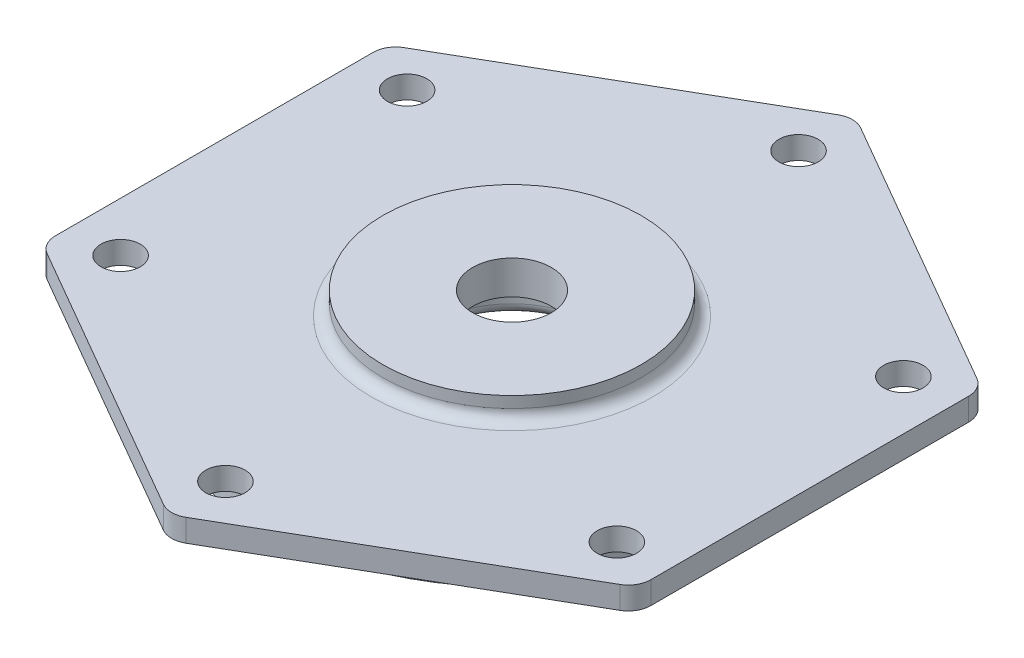
ISO-10303-21;
HEADER;
FILE_DESCRIPTION(('STEP AP214'),'2;1');
FILE_NAME('part.step','',(''),(''),'','','');
FILE_SCHEMA(('AUTOMOTIVE_DESIGN { 1 0 10303 214 1 1 1 1 }'));
ENDSEC;
DATA;
#1=APPLICATION_CONTEXT('core data for automotive mechanical design processes');
#2=APPLICATION_PROTOCOL_DEFINITION('international standard','automotive_design',2000,#1);
#3=PRODUCT_CONTEXT('',#1,'mechanical');
#4=PRODUCT('Part','Part','',(#3));
#5=PRODUCT_RELATED_PRODUCT_CATEGORY('part','',(#4));
#6=PRODUCT_DEFINITION_FORMATION('','',#4);
#7=PRODUCT_DEFINITION_CONTEXT('part definition',#1,'design');
#8=PRODUCT_DEFINITION('design','',#6,#7);
#9=PRODUCT_DEFINITION_SHAPE('','',#8);
#10=(LENGTH_UNIT() NAMED_UNIT(*) SI_UNIT(.MILLI.,.METRE.));
#11=(NAMED_UNIT(*) PLANE_ANGLE_UNIT() SI_UNIT($,.RADIAN.));
#12=(NAMED_UNIT(*) SI_UNIT($,.STERADIAN.) SOLID_ANGLE_UNIT());
#13=UNCERTAINTY_MEASURE_WITH_UNIT(LENGTH_MEASURE(1.E-05),#10,'distance_accuracy_value','');
#14=(GEOMETRIC_REPRESENTATION_CONTEXT(3) GLOBAL_UNCERTAINTY_ASSIGNED_CONTEXT((#13)) GLOBAL_UNIT_ASSIGNED_CONTEXT((#10,
#11,#12)) REPRESENTATION_CONTEXT('',''));
#15=CARTESIAN_POINT('',(0.,0.,0.));
#16=DIRECTION('',(0.,0.,1.));
#17=DIRECTION('',(1.,0.,0.));
#18=AXIS2_PLACEMENT_3D('',#15,#16,#17);
#19=CARTESIAN_POINT('',(-49.,4.,-28.2901631902917));
#20=DIRECTION('',(0.,-1.,0.));
#21=DIRECTION('',(0.,0.,-1.));
#22=AXIS2_PLACEMENT_3D('',#19,#20,#21);
#23=CYLINDRICAL_SURFACE('',#22,4.);
#24=CARTESIAN_POINT('',(-49.,0.,-28.2901631902917));
#25=DIRECTION('',(0.,1.,0.));
#26=DIRECTION('',(0.,0.,1.));
#27=AXIS2_PLACEMENT_3D('',#24,#25,#26);
#28=CIRCLE('',#27,4.);
#29=CARTESIAN_POINT('',(-51.,0.,-31.7542648054295));
#30=VERTEX_POINT('',#29);
#31=CARTESIAN_POINT('',(-53.,0.,-28.2901631902917));
#32=VERTEX_POINT('',#31);
#33=EDGE_CURVE('E172',#30,#32,#28,.T.);
#34=ORIENTED_EDGE('',*,*,#33,.T.);
#35=DIRECTION('',(0.,-1.,0.));
#36=VECTOR('',#35,1.);
#37=CARTESIAN_POINT('',(-53.,4.,-28.2901631902917));
#38=LINE('',#37,#36);
#39=CARTESIAN_POINT('',(-53.,4.,-28.2901631902917));
#40=VERTEX_POINT('',#39);
#41=EDGE_CURVE('E242',#40,#32,#38,.T.);
#42=ORIENTED_EDGE('',*,*,#41,.F.);
#43=CARTESIAN_POINT('',(-49.,4.,-28.2901631902917));
#44=DIRECTION('',(0.,1.,0.));
#45=DIRECTION('',(0.,0.,1.));
#46=AXIS2_PLACEMENT_3D('',#43,#44,#45);
#47=CIRCLE('',#46,4.);
#48=CARTESIAN_POINT('',(-51.,4.,-31.7542648054295));
#49=VERTEX_POINT('',#48);
#50=EDGE_CURVE('E207',#49,#40,#47,.T.);
#51=ORIENTED_EDGE('',*,*,#50,.F.);
#52=DIRECTION('',(0.,-1.,0.));
#53=VECTOR('',#52,1.);
#54=CARTESIAN_POINT('',(-51.,4.,-31.7542648054295));
#55=LINE('',#54,#53);
#56=EDGE_CURVE('E168',#49,#30,#55,.T.);
#57=ORIENTED_EDGE('',*,*,#56,.T.);
#58=EDGE_LOOP('',(#34,#42,#51,#57));
#59=FACE_BOUND('',#58,.T.);
#60=ADVANCED_FACE('F43',(#59),#23,.T.);
#61=CARTESIAN_POINT('',(-53.,4.,-28.2901631902917));
#62=DIRECTION('',(1.,0.,0.));
#63=DIRECTION('',(0.,0.,-1.));
#64=AXIS2_PLACEMENT_3D('',#61,#62,#63);
#65=PLANE('',#64);
#66=DIRECTION('',(0.,0.,1.));
#67=VECTOR('',#66,1.);
#68=CARTESIAN_POINT('',(-53.,0.,-28.2901631902917));
#69=LINE('',#68,#67);
#70=CARTESIAN_POINT('',(-53.,0.,28.2901631902916));
#71=VERTEX_POINT('',#70);
#72=EDGE_CURVE('E176',#32,#71,#69,.T.);
#73=ORIENTED_EDGE('',*,*,#72,.T.);
#74=DIRECTION('',(0.,-1.,0.));
#75=VECTOR('',#74,1.);
#76=CARTESIAN_POINT('',(-53.,4.,28.2901631902916));
#77=LINE('',#76,#75);
#78=CARTESIAN_POINT('',(-53.,4.,28.2901631902916));
#79=VERTEX_POINT('',#78);
#80=EDGE_CURVE('E238',#79,#71,#77,.T.);
#81=ORIENTED_EDGE('',*,*,#80,.F.);
#82=DIRECTION('',(0.,0.,1.));
#83=VECTOR('',#82,1.);
#84=CARTESIAN_POINT('',(-53.,4.,-28.2901631902917));
#85=LINE('',#84,#83);
#86=EDGE_CURVE('E119',#40,#79,#85,.T.);
#87=ORIENTED_EDGE('',*,*,#86,.F.);
#88=ORIENTED_EDGE('',*,*,#41,.T.);
#89=EDGE_LOOP('',(#73,#81,#87,#88));
#90=FACE_BOUND('',#89,.T.);
#91=ADVANCED_FACE('F379',(#90),#65,.F.);
#92=CARTESIAN_POINT('',(-49.,4.,28.2901631902916));
#93=DIRECTION('',(0.,-1.,0.));
#94=DIRECTION('',(0.,0.,-1.));
#95=AXIS2_PLACEMENT_3D('',#92,#93,#94);
#96=CYLINDRICAL_SURFACE('',#95,4.);
#97=CARTESIAN_POINT('',(-49.,0.,28.2901631902916));
#98=DIRECTION('',(0.,1.,0.));
#99=DIRECTION('',(0.,0.,-1.));
#100=AXIS2_PLACEMENT_3D('',#97,#98,#99);
#101=CIRCLE('',#100,4.);
#102=CARTESIAN_POINT('',(-51.,0.,31.7542648054294));
#103=VERTEX_POINT('',#102);
#104=EDGE_CURVE('E180',#71,#103,#101,.T.);
#105=ORIENTED_EDGE('',*,*,#104,.T.);
#106=DIRECTION('',(0.,-1.,0.));
#107=VECTOR('',#106,1.);
#108=CARTESIAN_POINT('',(-51.,4.,31.7542648054294));
#109=LINE('',#108,#107);
#110=CARTESIAN_POINT('',(-51.,4.,31.7542648054294));
#111=VERTEX_POINT('',#110);
#112=EDGE_CURVE('E234',#111,#103,#109,.T.);
#113=ORIENTED_EDGE('',*,*,#112,.F.);
#114=CARTESIAN_POINT('',(-49.,4.,28.2901631902916));
#115=DIRECTION('',(0.,1.,0.));
#116=DIRECTION('',(0.,0.,-1.));
#117=AXIS2_PLACEMENT_3D('',#114,#115,#116);
#118=CIRCLE('',#117,4.);
#119=EDGE_CURVE('E332',#79,#111,#118,.T.);
#120=ORIENTED_EDGE('',*,*,#119,.F.);
#121=ORIENTED_EDGE('',*,*,#80,.T.);
#122=EDGE_LOOP('',(#105,#113,#120,#121));
#123=FACE_BOUND('',#122,.T.);
#124=ADVANCED_FACE('F384',(#123),#96,.T.);
#125=CARTESIAN_POINT('',(-51.,4.,31.7542648054294));
#126=DIRECTION('',(0.5,0.,-0.866025403784439));
#127=DIRECTION('',(-0.866025403784439,0.,-0.5));
#128=AXIS2_PLACEMENT_3D('',#125,#126,#127);
#129=PLANE('',#128);
#130=DIRECTION('',(0.866025403784438,0.,0.5));
#131=VECTOR('',#130,1.);
#132=CARTESIAN_POINT('',(-51.,0.,31.7542648054294));
#133=LINE('',#132,#131);
#134=CARTESIAN_POINT('',(-1.99999999999996,0.,60.0444279957211));
#135=VERTEX_POINT('',#134);
#136=EDGE_CURVE('E183',#103,#135,#133,.T.);
#137=ORIENTED_EDGE('',*,*,#136,.T.);
#138=DIRECTION('',(0.,-1.,0.));
#139=VECTOR('',#138,1.);
#140=CARTESIAN_POINT('',(-1.99999999999996,4.,60.0444279957211));
#141=LINE('',#140,#139);
#142=CARTESIAN_POINT('',(-1.99999999999996,4.,60.0444279957211));
#143=VERTEX_POINT('',#142);
#144=EDGE_CURVE('E230',#143,#135,#141,.T.);
#145=ORIENTED_EDGE('',*,*,#144,.F.);
#146=DIRECTION('',(0.866025403784438,0.,0.5));
#147=VECTOR('',#146,1.);
#148=CARTESIAN_POINT('',(-51.,4.,31.7542648054294));
#149=LINE('',#148,#147);
#150=EDGE_CURVE('E335',#111,#143,#149,.T.);
#151=ORIENTED_EDGE('',*,*,#150,.F.);
#152=ORIENTED_EDGE('',*,*,#112,.T.);
#153=EDGE_LOOP('',(#137,#145,#151,#152));
#154=FACE_BOUND('',#153,.T.);
#155=ADVANCED_FACE('F728',(#154),#129,.F.);
#156=CARTESIAN_POINT('',(0.,4.,56.5803263805833));
#157=DIRECTION('',(0.,-1.,0.));
#158=DIRECTION('',(0.,0.,-1.));
#159=AXIS2_PLACEMENT_3D('',#156,#157,#158);
#160=CYLINDRICAL_SURFACE('',#159,4.00000000000001);
#161=CARTESIAN_POINT('',(0.,0.,56.5803263805833));
#162=DIRECTION('',(0.,1.,0.));
#163=DIRECTION('',(0.,0.,1.));
#164=AXIS2_PLACEMENT_3D('',#161,#162,#163);
#165=CIRCLE('',#164,4.00000000000001);
#166=CARTESIAN_POINT('',(2.00000000000008,0.,60.0444279957211));
#167=VERTEX_POINT('',#166);
#168=EDGE_CURVE('E186',#135,#167,#165,.T.);
#169=ORIENTED_EDGE('',*,*,#168,.T.);
#170=DIRECTION('',(0.,-1.,0.));
#171=VECTOR('',#170,1.);
#172=CARTESIAN_POINT('',(2.00000000000008,4.,60.0444279957211));
#173=LINE('',#172,#171);
#174=CARTESIAN_POINT('',(2.00000000000008,4.,60.0444279957211));
#175=VERTEX_POINT('',#174);
#176=EDGE_CURVE('E226',#175,#167,#173,.T.);
#177=ORIENTED_EDGE('',*,*,#176,.F.);
#178=CARTESIAN_POINT('',(0.,4.,56.5803263805833));
#179=DIRECTION('',(0.,1.,0.));
#180=DIRECTION('',(0.,0.,1.));
#181=AXIS2_PLACEMENT_3D('',#178,#179,#180);
#182=CIRCLE('',#181,4.00000000000001);
#183=EDGE_CURVE('E338',#143,#175,#182,.T.);
#184=ORIENTED_EDGE('',*,*,#183,.F.);
#185=ORIENTED_EDGE('',*,*,#144,.T.);
#186=EDGE_LOOP('',(#169,#177,#184,#185));
#187=FACE_BOUND('',#186,.T.);
#188=ADVANCED_FACE('F717',(#187),#160,.T.);
#189=CARTESIAN_POINT('',(2.00000000000008,4.,60.0444279957211));
#190=DIRECTION('',(-0.5,0.,-0.866025403784439));
#191=DIRECTION('',(-0.866025403784438,0.,0.5));
#192=AXIS2_PLACEMENT_3D('',#189,#190,#191);
#193=PLANE('',#192);
#194=DIRECTION('',(0.866025403784438,0.,-0.5));
#195=VECTOR('',#194,1.);
#196=CARTESIAN_POINT('',(2.00000000000008,0.,60.0444279957211));
#197=LINE('',#196,#195);
#198=CARTESIAN_POINT('',(51.,0.,31.7542648054295));
#199=VERTEX_POINT('',#198);
#200=EDGE_CURVE('E189',#167,#199,#197,.T.);
#201=ORIENTED_EDGE('',*,*,#200,.T.);
#202=DIRECTION('',(0.,-1.,0.));
#203=VECTOR('',#202,1.);
#204=CARTESIAN_POINT('',(51.,4.,31.7542648054295));
#205=LINE('',#204,#203);
#206=CARTESIAN_POINT('',(51.,4.,31.7542648054295));
#207=VERTEX_POINT('',#206);
#208=EDGE_CURVE('E222',#207,#199,#205,.T.);
#209=ORIENTED_EDGE('',*,*,#208,.F.);
#210=DIRECTION('',(0.866025403784438,0.,-0.5));
#211=VECTOR('',#210,1.);
#212=CARTESIAN_POINT('',(2.00000000000008,4.,60.0444279957211));
#213=LINE('',#212,#211);
#214=EDGE_CURVE('E341',#175,#207,#213,.T.);
#215=ORIENTED_EDGE('',*,*,#214,.F.);
#216=ORIENTED_EDGE('',*,*,#176,.T.);
#217=EDGE_LOOP('',(#201,#209,#215,#216));
#218=FACE_BOUND('',#217,.T.);
#219=ADVANCED_FACE('F706',(#218),#193,.F.);
#220=CARTESIAN_POINT('',(49.,4.,28.2901631902917));
#221=DIRECTION('',(0.,-1.,0.));
#222=DIRECTION('',(0.,0.,-1.));
#223=AXIS2_PLACEMENT_3D('',#220,#221,#222);
#224=CYLINDRICAL_SURFACE('',#223,4.);
#225=CARTESIAN_POINT('',(49.,0.,28.2901631902917));
#226=DIRECTION('',(0.,1.,0.));
#227=DIRECTION('',(0.,0.,1.));
#228=AXIS2_PLACEMENT_3D('',#225,#226,#227);
#229=CIRCLE('',#228,4.);
#230=CARTESIAN_POINT('',(53.,0.,28.2901631902917));
#231=VERTEX_POINT('',#230);
#232=EDGE_CURVE('E192',#199,#231,#229,.T.);
#233=ORIENTED_EDGE('',*,*,#232,.T.);
#234=DIRECTION('',(0.,-1.,0.));
#235=VECTOR('',#234,1.);
#236=CARTESIAN_POINT('',(53.,4.,28.2901631902917));
#237=LINE('',#236,#235);
#238=CARTESIAN_POINT('',(53.,4.,28.2901631902917));
#239=VERTEX_POINT('',#238);
#240=EDGE_CURVE('E218',#239,#231,#237,.T.);
#241=ORIENTED_EDGE('',*,*,#240,.F.);
#242=CARTESIAN_POINT('',(49.,4.,28.2901631902917));
#243=DIRECTION('',(0.,1.,0.));
#244=DIRECTION('',(0.,0.,1.));
#245=AXIS2_PLACEMENT_3D('',#242,#243,#244);
#246=CIRCLE('',#245,4.);
#247=EDGE_CURVE('E344',#207,#239,#246,.T.);
#248=ORIENTED_EDGE('',*,*,#247,.F.);
#249=ORIENTED_EDGE('',*,*,#208,.T.);
#250=EDGE_LOOP('',(#233,#241,#248,#249));
#251=FACE_BOUND('',#250,.T.);
#252=ADVANCED_FACE('F696',(#251),#224,.T.);
#253=CARTESIAN_POINT('',(53.,4.,28.2901631902917));
#254=DIRECTION('',(-1.,0.,0.));
#255=DIRECTION('',(0.,0.,1.));
#256=AXIS2_PLACEMENT_3D('',#253,#254,#255);
#257=PLANE('',#256);
#258=DIRECTION('',(0.,0.,-1.));
#259=VECTOR('',#258,1.);
#260=CARTESIAN_POINT('',(53.,0.,28.2901631902917));
#261=LINE('',#260,#259);
#262=CARTESIAN_POINT('',(53.,0.,-28.2901631902917));
#263=VERTEX_POINT('',#262);
#264=EDGE_CURVE('E195',#231,#263,#261,.T.);
#265=ORIENTED_EDGE('',*,*,#264,.T.);
#266=DIRECTION('',(0.,-1.,0.));
#267=VECTOR('',#266,1.);
#268=CARTESIAN_POINT('',(53.,4.,-28.2901631902917));
#269=LINE('',#268,#267);
#270=CARTESIAN_POINT('',(53.,4.,-28.2901631902917));
#271=VERTEX_POINT('',#270);
#272=EDGE_CURVE('E214',#271,#263,#269,.T.);
#273=ORIENTED_EDGE('',*,*,#272,.F.);
#274=DIRECTION('',(0.,0.,-1.));
#275=VECTOR('',#274,1.);
#276=CARTESIAN_POINT('',(53.,4.,28.2901631902917));
#277=LINE('',#276,#275);
#278=EDGE_CURVE('E347',#239,#271,#277,.T.);
#279=ORIENTED_EDGE('',*,*,#278,.F.);
#280=ORIENTED_EDGE('',*,*,#240,.T.);
#281=EDGE_LOOP('',(#265,#273,#279,#280));
#282=FACE_BOUND('',#281,.T.);
#283=ADVANCED_FACE('F355',(#282),#257,.F.);
#284=CARTESIAN_POINT('',(49.,4.,-28.2901631902917));
#285=DIRECTION('',(0.,-1.,0.));
#286=DIRECTION('',(0.,0.,-1.));
#287=AXIS2_PLACEMENT_3D('',#284,#285,#286);
#288=CYLINDRICAL_SURFACE('',#287,4.);
#289=CARTESIAN_POINT('',(49.,0.,-28.2901631902917));
#290=DIRECTION('',(0.,1.,0.));
#291=DIRECTION('',(0.,0.,1.));
#292=AXIS2_PLACEMENT_3D('',#289,#290,#291);
#293=CIRCLE('',#292,4.);
#294=CARTESIAN_POINT('',(51.,0.,-31.7542648054294));
#295=VERTEX_POINT('',#294);
#296=EDGE_CURVE('E198',#263,#295,#293,.T.);
#297=ORIENTED_EDGE('',*,*,#296,.T.);
#298=DIRECTION('',(0.,-1.,0.));
#299=VECTOR('',#298,1.);
#300=CARTESIAN_POINT('',(51.,4.,-31.7542648054294));
#301=LINE('',#300,#299);
#302=CARTESIAN_POINT('',(51.,4.,-31.7542648054294));
#303=VERTEX_POINT('',#302);
#304=EDGE_CURVE('E161',#303,#295,#301,.T.);
#305=ORIENTED_EDGE('',*,*,#304,.F.);
#306=CARTESIAN_POINT('',(49.,4.,-28.2901631902917));
#307=DIRECTION('',(0.,1.,0.));
#308=DIRECTION('',(0.,0.,1.));
#309=AXIS2_PLACEMENT_3D('',#306,#307,#308);
#310=CIRCLE('',#309,4.);
#311=EDGE_CURVE('E150',#271,#303,#310,.T.);
#312=ORIENTED_EDGE('',*,*,#311,.F.);
#313=ORIENTED_EDGE('',*,*,#272,.T.);
#314=EDGE_LOOP('',(#297,#305,#312,#313));
#315=FACE_BOUND('',#314,.T.);
#316=ADVANCED_FACE('F359',(#315),#288,.T.);
#317=CARTESIAN_POINT('',(51.,4.,-31.7542648054294));
#318=DIRECTION('',(-0.5,0.,0.866025403784439));
#319=DIRECTION('',(0.866025403784439,0.,0.5));
#320=AXIS2_PLACEMENT_3D('',#317,#318,#319);
#321=PLANE('',#320);
#322=DIRECTION('',(-0.866025403784439,0.,-0.5));
#323=VECTOR('',#322,1.);
#324=CARTESIAN_POINT('',(51.,0.,-31.7542648054294));
#325=LINE('',#324,#323);
#326=CARTESIAN_POINT('',(2.00000000000002,0.,-60.0444279957211));
#327=VERTEX_POINT('',#326);
#328=EDGE_CURVE('E159',#295,#327,#325,.T.);
#329=ORIENTED_EDGE('',*,*,#328,.T.);
#330=DIRECTION('',(0.,-1.,0.));
#331=VECTOR('',#330,1.);
#332=CARTESIAN_POINT('',(2.00000000000002,4.,-60.0444279957211));
#333=LINE('',#332,#331);
#334=CARTESIAN_POINT('',(2.00000000000002,4.,-60.0444279957211));
#335=VERTEX_POINT('',#334);
#336=EDGE_CURVE('E156',#335,#327,#333,.T.);
#337=ORIENTED_EDGE('',*,*,#336,.F.);
#338=DIRECTION('',(-0.866025403784439,0.,-0.5));
#339=VECTOR('',#338,1.);
#340=CARTESIAN_POINT('',(51.,4.,-31.7542648054294));
#341=LINE('',#340,#339);
#342=EDGE_CURVE('E144',#303,#335,#341,.T.);
#343=ORIENTED_EDGE('',*,*,#342,.F.);
#344=ORIENTED_EDGE('',*,*,#304,.T.);
#345=EDGE_LOOP('',(#329,#337,#343,#344));
#346=FACE_BOUND('',#345,.T.);
#347=ADVANCED_FACE('F157',(#346),#321,.F.);
#348=CARTESIAN_POINT('',(0.,4.,-56.5803263805833));
#349=DIRECTION('',(0.,-1.,0.));
#350=DIRECTION('',(0.,0.,-1.));
#351=AXIS2_PLACEMENT_3D('',#348,#349,#350);
#352=CYLINDRICAL_SURFACE('',#351,4.);
#353=CARTESIAN_POINT('',(0.,0.,-56.5803263805833));
#354=DIRECTION('',(0.,1.,0.));
#355=DIRECTION('',(0.,0.,1.));
#356=AXIS2_PLACEMENT_3D('',#353,#354,#355);
#357=CIRCLE('',#356,4.);
#358=CARTESIAN_POINT('',(-2.00000000000002,0.,-60.0444279957211));
#359=VERTEX_POINT('',#358);
#360=EDGE_CURVE('E104',#327,#359,#357,.T.);
#361=ORIENTED_EDGE('',*,*,#360,.T.);
#362=DIRECTION('',(0.,-1.,0.));
#363=VECTOR('',#362,1.);
#364=CARTESIAN_POINT('',(-2.00000000000002,4.,-60.0444279957211));
#365=LINE('',#364,#363);
#366=CARTESIAN_POINT('',(-2.00000000000002,4.,-60.0444279957211));
#367=VERTEX_POINT('',#366);
#368=EDGE_CURVE('E162',#367,#359,#365,.T.);
#369=ORIENTED_EDGE('',*,*,#368,.F.);
#370=CARTESIAN_POINT('',(0.,4.,-56.5803263805833));
#371=DIRECTION('',(0.,1.,0.));
#372=DIRECTION('',(0.,0.,1.));
#373=AXIS2_PLACEMENT_3D('',#370,#371,#372);
#374=CIRCLE('',#373,4.);
#375=EDGE_CURVE('E148',#335,#367,#374,.T.);
#376=ORIENTED_EDGE('',*,*,#375,.F.);
#377=ORIENTED_EDGE('',*,*,#336,.T.);
#378=EDGE_LOOP('',(#361,#369,#376,#377));
#379=FACE_BOUND('',#378,.T.);
#380=ADVANCED_FACE('F164',(#379),#352,.T.);
#381=CARTESIAN_POINT('',(-2.00000000000002,4.,-60.0444279957211));
#382=DIRECTION('',(0.5,0.,0.866025403784439));
#383=DIRECTION('',(0.866025403784439,0.,-0.5));
#384=AXIS2_PLACEMENT_3D('',#381,#382,#383);
#385=PLANE('',#384);
#386=DIRECTION('',(-0.866025403784439,0.,0.5));
#387=VECTOR('',#386,1.);
#388=CARTESIAN_POINT('',(-2.00000000000002,0.,-60.0444279957211));
#389=LINE('',#388,#387);
#390=EDGE_CURVE('E110',#359,#30,#389,.T.);
#391=ORIENTED_EDGE('',*,*,#390,.T.);
#392=ORIENTED_EDGE('',*,*,#56,.F.);
#393=DIRECTION('',(-0.866025403784439,0.,0.5));
#394=VECTOR('',#393,1.);
#395=CARTESIAN_POINT('',(-2.00000000000002,4.,-60.0444279957211));
#396=LINE('',#395,#394);
#397=EDGE_CURVE('E63',#367,#49,#396,.T.);
#398=ORIENTED_EDGE('',*,*,#397,.F.);
#399=ORIENTED_EDGE('',*,*,#368,.T.);
#400=EDGE_LOOP('',(#391,#392,#398,#399));
#401=FACE_BOUND('',#400,.T.);
#402=ADVANCED_FACE('F367',(#401),#385,.F.);
#403=CARTESIAN_POINT('',(-49.,4.,-28.2901631902917));
#404=DIRECTION('',(0.,1.,0.));
#405=DIRECTION('',(0.,0.,1.));
#406=AXIS2_PLACEMENT_3D('',#403,#404,#405);
#407=PLANE('',#406);
#408=CARTESIAN_POINT('',(0.,4.,-51.));
#409=DIRECTION('',(0.,1.,0.));
#410=DIRECTION('',(0.,0.,1.));
#411=AXIS2_PLACEMENT_3D('',#408,#409,#410);
#412=CIRCLE('',#411,3.5);
#413=CARTESIAN_POINT('',(0.,4.,-47.5));
#414=VERTEX_POINT('',#413);
#415=EDGE_CURVE('E270',#414,#414,#412,.T.);
#416=ORIENTED_EDGE('',*,*,#415,.F.);
#417=EDGE_LOOP('',(#416));
#418=FACE_BOUND('',#417,.T.);
#419=CARTESIAN_POINT('',(-44.1672955930049,4.,-25.4999999999975));
#420=DIRECTION('',(0.,1.,0.));
#421=DIRECTION('',(0.,0.,1.));
#422=AXIS2_PLACEMENT_3D('',#419,#420,#421);
#423=CIRCLE('',#422,3.50000000000272);
#424=CARTESIAN_POINT('',(-44.1672955930049,4.,-21.9999999999947));
#425=VERTEX_POINT('',#424);
#426=EDGE_CURVE('E807',#425,#425,#423,.T.);
#427=ORIENTED_EDGE('',*,*,#426,.F.);
#428=EDGE_LOOP('',(#427));
#429=FACE_BOUND('',#428,.T.);
#430=CARTESIAN_POINT('',(-44.167295593002,4.,25.5000000000025));
#431=DIRECTION('',(0.,1.,0.));
#432=DIRECTION('',(0.,0.,1.));
#433=AXIS2_PLACEMENT_3D('',#430,#431,#432);
#434=CIRCLE('',#433,3.50000000000536);
#435=CARTESIAN_POINT('',(-44.167295593002,4.,29.0000000000079));
#436=VERTEX_POINT('',#435);
#437=EDGE_CURVE('E810',#436,#436,#434,.T.);
#438=ORIENTED_EDGE('',*,*,#437,.F.);
#439=EDGE_LOOP('',(#438));
#440=FACE_BOUND('',#439,.T.);
#441=CARTESIAN_POINT('',(5.77929162777546E-12,4.,51.));
#442=DIRECTION('',(0.,1.,0.));
#443=DIRECTION('',(0.,0.,1.));
#444=AXIS2_PLACEMENT_3D('',#441,#442,#443);
#445=CIRCLE('',#444,3.50000000000587);
#446=CARTESIAN_POINT('',(5.77929162777546E-12,4.,54.5000000000059));
#447=VERTEX_POINT('',#446);
#448=EDGE_CURVE('E815',#447,#447,#445,.T.);
#449=ORIENTED_EDGE('',*,*,#448,.F.);
#450=EDGE_LOOP('',(#449));
#451=FACE_BOUND('',#450,.T.);
#452=CARTESIAN_POINT('',(44.1672955930107,4.,25.4999999999975));
#453=DIRECTION('',(0.,1.,0.));
#454=DIRECTION('',(0.,0.,1.));
#455=AXIS2_PLACEMENT_3D('',#452,#453,#454);
#456=CIRCLE('',#455,3.50000000000365);
#457=CARTESIAN_POINT('',(44.1672955930107,4.,29.0000000000011));
#458=VERTEX_POINT('',#457);
#459=EDGE_CURVE('E804',#458,#458,#456,.T.);
#460=ORIENTED_EDGE('',*,*,#459,.F.);
#461=EDGE_LOOP('',(#460));
#462=FACE_BOUND('',#461,.T.);
#463=CARTESIAN_POINT('',(44.1672955930078,4.,-25.5000000000025));
#464=DIRECTION('',(0.,1.,0.));
#465=DIRECTION('',(0.,0.,1.));
#466=AXIS2_PLACEMENT_3D('',#463,#464,#465);
#467=CIRCLE('',#466,3.50000000000079);
#468=CARTESIAN_POINT('',(44.1672955930078,4.,-22.0000000000017));
#469=VERTEX_POINT('',#468);
#470=EDGE_CURVE('E801',#469,#469,#467,.T.);
#471=ORIENTED_EDGE('',*,*,#470,.F.);
#472=EDGE_LOOP('',(#471));
#473=FACE_BOUND('',#472,.T.);
#474=CARTESIAN_POINT('',(0.,4.,0.));
#475=DIRECTION('',(0.,1.,0.));
#476=DIRECTION('',(0.,0.,1.));
#477=AXIS2_PLACEMENT_3D('',#474,#475,#476);
#478=CIRCLE('',#477,25.);
#479=CARTESIAN_POINT('',(0.,4.,25.));
#480=VERTEX_POINT('',#479);
#481=EDGE_CURVE('E250',#480,#480,#478,.F.);
#482=ORIENTED_EDGE('',*,*,#481,.T.);
#483=EDGE_LOOP('',(#482));
#484=FACE_BOUND('',#483,.T.);
#485=ORIENTED_EDGE('',*,*,#50,.T.);
#486=ORIENTED_EDGE('',*,*,#86,.T.);
#487=ORIENTED_EDGE('',*,*,#119,.T.);
#488=ORIENTED_EDGE('',*,*,#150,.T.);
#489=ORIENTED_EDGE('',*,*,#183,.T.);
#490=ORIENTED_EDGE('',*,*,#214,.T.);
#491=ORIENTED_EDGE('',*,*,#247,.T.);
#492=ORIENTED_EDGE('',*,*,#278,.T.);
#493=ORIENTED_EDGE('',*,*,#311,.T.);
#494=ORIENTED_EDGE('',*,*,#342,.T.);
#495=ORIENTED_EDGE('',*,*,#375,.T.);
#496=ORIENTED_EDGE('',*,*,#397,.T.);
#497=EDGE_LOOP('',(#485,#486,#487,#488,#489,#490,#491,#492,#493,#494,#495,#496));
#498=FACE_BOUND('',#497,.T.);
#499=ADVANCED_FACE('F146',(#418,#429,#440,#451,#462,#473,#484,#498),#407,.T.);
#500=CARTESIAN_POINT('',(-49.,0.,-28.2901631902917));
#501=DIRECTION('',(0.,1.,0.));
#502=DIRECTION('',(0.,0.,1.));
#503=AXIS2_PLACEMENT_3D('',#500,#501,#502);
#504=PLANE('',#503);
#505=CARTESIAN_POINT('',(0.,0.,-51.));
#506=DIRECTION('',(0.,1.,0.));
#507=DIRECTION('',(0.,0.,1.));
#508=AXIS2_PLACEMENT_3D('',#505,#506,#507);
#509=CIRCLE('',#508,3.5);
#510=CARTESIAN_POINT('',(0.,0.,-47.5));
#511=VERTEX_POINT('',#510);
#512=EDGE_CURVE('E47',#511,#511,#509,.T.);
#513=ORIENTED_EDGE('',*,*,#512,.T.);
#514=EDGE_LOOP('',(#513));
#515=FACE_BOUND('',#514,.T.);
#516=CARTESIAN_POINT('',(-44.1672955930049,0.,-25.4999999999975));
#517=DIRECTION('',(0.,1.,0.));
#518=DIRECTION('',(0.,0.,1.));
#519=AXIS2_PLACEMENT_3D('',#516,#517,#518);
#520=CIRCLE('',#519,3.50000000000272);
#521=CARTESIAN_POINT('',(-44.1672955930049,0.,-21.9999999999947));
#522=VERTEX_POINT('',#521);
#523=EDGE_CURVE('E281',#522,#522,#520,.T.);
#524=ORIENTED_EDGE('',*,*,#523,.T.);
#525=EDGE_LOOP('',(#524));
#526=FACE_BOUND('',#525,.T.);
#527=CARTESIAN_POINT('',(-44.167295593002,0.,25.5000000000025));
#528=DIRECTION('',(0.,1.,0.));
#529=DIRECTION('',(0.,0.,1.));
#530=AXIS2_PLACEMENT_3D('',#527,#528,#529);
#531=CIRCLE('',#530,3.50000000000536);
#532=CARTESIAN_POINT('',(-44.167295593002,0.,29.0000000000079));
#533=VERTEX_POINT('',#532);
#534=EDGE_CURVE('E278',#533,#533,#531,.T.);
#535=ORIENTED_EDGE('',*,*,#534,.T.);
#536=EDGE_LOOP('',(#535));
#537=FACE_BOUND('',#536,.T.);
#538=CARTESIAN_POINT('',(5.77929162777546E-12,0.,51.));
#539=DIRECTION('',(0.,1.,0.));
#540=DIRECTION('',(0.,0.,1.));
#541=AXIS2_PLACEMENT_3D('',#538,#539,#540);
#542=CIRCLE('',#541,3.50000000000587);
#543=CARTESIAN_POINT('',(5.77929162777546E-12,0.,54.5000000000059));
#544=VERTEX_POINT('',#543);
#545=EDGE_CURVE('E274',#544,#544,#542,.T.);
#546=ORIENTED_EDGE('',*,*,#545,.T.);
#547=EDGE_LOOP('',(#546));
#548=FACE_BOUND('',#547,.T.);
#549=CARTESIAN_POINT('',(44.1672955930107,0.,25.4999999999975));
#550=DIRECTION('',(0.,1.,0.));
#551=DIRECTION('',(0.,0.,1.));
#552=AXIS2_PLACEMENT_3D('',#549,#550,#551);
#553=CIRCLE('',#552,3.50000000000365);
#554=CARTESIAN_POINT('',(44.1672955930107,0.,29.0000000000011));
#555=VERTEX_POINT('',#554);
#556=EDGE_CURVE('E269',#555,#555,#553,.T.);
#557=ORIENTED_EDGE('',*,*,#556,.T.);
#558=EDGE_LOOP('',(#557));
#559=FACE_BOUND('',#558,.T.);
#560=CARTESIAN_POINT('',(44.1672955930078,0.,-25.5000000000025));
#561=DIRECTION('',(0.,1.,0.));
#562=DIRECTION('',(0.,0.,1.));
#563=AXIS2_PLACEMENT_3D('',#560,#561,#562);
#564=CIRCLE('',#563,3.50000000000079);
#565=CARTESIAN_POINT('',(44.1672955930078,0.,-22.0000000000017));
#566=VERTEX_POINT('',#565);
#567=EDGE_CURVE('E265',#566,#566,#564,.T.);
#568=ORIENTED_EDGE('',*,*,#567,.T.);
#569=EDGE_LOOP('',(#568));
#570=FACE_BOUND('',#569,.T.);
#571=CARTESIAN_POINT('',(0.,0.,0.));
#572=DIRECTION('',(0.,-1.,0.));
#573=DIRECTION('',(0.,0.,-1.));
#574=AXIS2_PLACEMENT_3D('',#571,#572,#573);
#575=CIRCLE('',#574,45.);
#576=CARTESIAN_POINT('',(0.,0.,-45.));
#577=VERTEX_POINT('',#576);
#578=EDGE_CURVE('E245',#577,#577,#575,.T.);
#579=ORIENTED_EDGE('',*,*,#578,.F.);
#580=EDGE_LOOP('',(#579));
#581=FACE_BOUND('',#580,.T.);
#582=ORIENTED_EDGE('',*,*,#33,.F.);
#583=ORIENTED_EDGE('',*,*,#390,.F.);
#584=ORIENTED_EDGE('',*,*,#360,.F.);
#585=ORIENTED_EDGE('',*,*,#328,.F.);
#586=ORIENTED_EDGE('',*,*,#296,.F.);
#587=ORIENTED_EDGE('',*,*,#264,.F.);
#588=ORIENTED_EDGE('',*,*,#232,.F.);
#589=ORIENTED_EDGE('',*,*,#200,.F.);
#590=ORIENTED_EDGE('',*,*,#168,.F.);
#591=ORIENTED_EDGE('',*,*,#136,.F.);
#592=ORIENTED_EDGE('',*,*,#104,.F.);
#593=ORIENTED_EDGE('',*,*,#72,.F.);
#594=EDGE_LOOP('',(#582,#583,#584,#585,#586,#587,#588,#589,#590,#591,#592,#593));
#595=FACE_BOUND('',#594,.T.);
#596=ADVANCED_FACE('F362',(#515,#526,#537,#548,#559,#570,#581,#595),#504,.F.);
#597=CARTESIAN_POINT('',(0.,8.,0.));
#598=DIRECTION('',(0.,-1.,0.));
#599=DIRECTION('',(0.,0.,-1.));
#600=AXIS2_PLACEMENT_3D('',#597,#598,#599);
#601=CYLINDRICAL_SURFACE('',#600,23.);
#602=CARTESIAN_POINT('',(0.,6.,0.));
#603=DIRECTION('',(0.,1.,0.));
#604=DIRECTION('',(0.,0.,1.));
#605=AXIS2_PLACEMENT_3D('',#602,#603,#604);
#606=CIRCLE('',#605,23.);
#607=CARTESIAN_POINT('',(0.,6.,23.));
#608=VERTEX_POINT('',#607);
#609=EDGE_CURVE('E246',#608,#608,#606,.T.);
#610=ORIENTED_EDGE('',*,*,#609,.T.);
#611=EDGE_LOOP('',(#610));
#612=FACE_BOUND('',#611,.T.);
#613=CARTESIAN_POINT('',(0.,8.,0.));
#614=DIRECTION('',(0.,1.,0.));
#615=DIRECTION('',(0.,0.,1.));
#616=AXIS2_PLACEMENT_3D('',#613,#614,#615);
#617=CIRCLE('',#616,23.);
#618=CARTESIAN_POINT('',(0.,8.,23.));
#619=VERTEX_POINT('',#618);
#620=EDGE_CURVE('E177',#619,#619,#617,.T.);
#621=ORIENTED_EDGE('',*,*,#620,.F.);
#622=EDGE_LOOP('',(#621));
#623=FACE_BOUND('',#622,.T.);
#624=ADVANCED_FACE('F435',(#612,#623),#601,.T.);
#625=CARTESIAN_POINT('',(0.,8.,0.));
#626=DIRECTION('',(0.,1.,0.));
#627=DIRECTION('',(0.,0.,1.));
#628=AXIS2_PLACEMENT_3D('',#625,#626,#627);
#629=PLANE('',#628);
#630=CARTESIAN_POINT('',(0.,8.,0.));
#631=DIRECTION('',(0.,-1.,0.));
#632=DIRECTION('',(0.,0.,-1.));
#633=AXIS2_PLACEMENT_3D('',#630,#631,#632);
#634=CIRCLE('',#633,7.);
#635=CARTESIAN_POINT('',(0.,8.,-7.));
#636=VERTEX_POINT('',#635);
#637=EDGE_CURVE('E293',#636,#636,#634,.T.);
#638=ORIENTED_EDGE('',*,*,#637,.T.);
#639=EDGE_LOOP('',(#638));
#640=FACE_BOUND('',#639,.T.);
#641=ORIENTED_EDGE('',*,*,#620,.T.);
#642=EDGE_LOOP('',(#641));
#643=FACE_BOUND('',#642,.T.);
#644=ADVANCED_FACE('F431',(#640,#643),#629,.T.);
#645=CARTESIAN_POINT('',(0.,-6.,0.));
#646=DIRECTION('',(0.,1.,0.));
#647=DIRECTION('',(0.,0.,1.));
#648=AXIS2_PLACEMENT_3D('',#645,#646,#647);
#649=CYLINDRICAL_SURFACE('',#648,45.);
#650=CARTESIAN_POINT('',(0.,-6.,0.));
#651=DIRECTION('',(0.,-1.,0.));
#652=DIRECTION('',(0.,0.,-1.));
#653=AXIS2_PLACEMENT_3D('',#650,#651,#652);
#654=CIRCLE('',#653,45.);
#655=CARTESIAN_POINT('',(0.,-6.,-45.));
#656=VERTEX_POINT('',#655);
#657=EDGE_CURVE('E318',#656,#656,#654,.T.);
#658=ORIENTED_EDGE('',*,*,#657,.F.);
#659=EDGE_LOOP('',(#658));
#660=FACE_BOUND('',#659,.T.);
#661=ORIENTED_EDGE('',*,*,#578,.T.);
#662=EDGE_LOOP('',(#661));
#663=FACE_BOUND('',#662,.T.);
#664=ADVANCED_FACE('F427',(#660,#663),#649,.T.);
#665=CARTESIAN_POINT('',(0.,-6.,0.));
#666=DIRECTION('',(0.,-1.,0.));
#667=DIRECTION('',(0.,0.,-1.));
#668=AXIS2_PLACEMENT_3D('',#665,#666,#667);
#669=PLANE('',#668);
#670=CARTESIAN_POINT('',(0.,-6.,0.));
#671=DIRECTION('',(0.,-1.,0.));
#672=DIRECTION('',(0.,0.,-1.));
#673=AXIS2_PLACEMENT_3D('',#670,#671,#672);
#674=CIRCLE('',#673,42.);
#675=CARTESIAN_POINT('',(0.,-6.,-42.));
#676=VERTEX_POINT('',#675);
#677=EDGE_CURVE('E258',#676,#676,#674,.F.);
#678=ORIENTED_EDGE('',*,*,#677,.T.);
#679=EDGE_LOOP('',(#678));
#680=FACE_BOUND('',#679,.T.);
#681=ORIENTED_EDGE('',*,*,#657,.T.);
#682=EDGE_LOOP('',(#681));
#683=FACE_BOUND('',#682,.T.);
#684=ADVANCED_FACE('F408',(#680,#683),#669,.T.);
#685=CARTESIAN_POINT('',(0.,0.,0.));
#686=DIRECTION('',(0.,-1.,0.));
#687=DIRECTION('',(0.,0.,-1.));
#688=AXIS2_PLACEMENT_3D('',#685,#686,#687);
#689=CYLINDRICAL_SURFACE('',#688,40.);
#690=CARTESIAN_POINT('',(0.,-4.,0.));
#691=DIRECTION('',(0.,-1.,0.));
#692=DIRECTION('',(0.,0.,-1.));
#693=AXIS2_PLACEMENT_3D('',#690,#691,#692);
#694=CIRCLE('',#693,40.);
#695=CARTESIAN_POINT('',(0.,-4.,-40.));
#696=VERTEX_POINT('',#695);
#697=EDGE_CURVE('E254',#696,#696,#694,.T.);
#698=ORIENTED_EDGE('',*,*,#697,.T.);
#699=EDGE_LOOP('',(#698));
#700=FACE_BOUND('',#699,.T.);
#701=CARTESIAN_POINT('',(0.,0.,0.));
#702=DIRECTION('',(0.,-1.,0.));
#703=DIRECTION('',(0.,0.,-1.));
#704=AXIS2_PLACEMENT_3D('',#701,#702,#703);
#705=CIRCLE('',#704,40.);
#706=CARTESIAN_POINT('',(0.,0.,-40.));
#707=VERTEX_POINT('',#706);
#708=EDGE_CURVE('E311',#707,#707,#705,.T.);
#709=ORIENTED_EDGE('',*,*,#708,.F.);
#710=EDGE_LOOP('',(#709));
#711=FACE_BOUND('',#710,.T.);
#712=ADVANCED_FACE('F404',(#700,#711),#689,.F.);
#713=CARTESIAN_POINT('',(0.,0.,0.));
#714=DIRECTION('',(0.,-1.,0.));
#715=DIRECTION('',(0.,0.,-1.));
#716=AXIS2_PLACEMENT_3D('',#713,#714,#715);
#717=PLANE('',#716);
#718=CARTESIAN_POINT('',(0.,0.,0.));
#719=DIRECTION('',(0.,-1.,0.));
#720=DIRECTION('',(0.,0.,-1.));
#721=AXIS2_PLACEMENT_3D('',#718,#719,#720);
#722=CIRCLE('',#721,19.);
#723=CARTESIAN_POINT('',(0.,0.,-19.));
#724=VERTEX_POINT('',#723);
#725=EDGE_CURVE('E307',#724,#724,#722,.T.);
#726=ORIENTED_EDGE('',*,*,#725,.F.);
#727=EDGE_LOOP('',(#726));
#728=FACE_BOUND('',#727,.T.);
#729=ORIENTED_EDGE('',*,*,#708,.T.);
#730=EDGE_LOOP('',(#729));
#731=FACE_BOUND('',#730,.T.);
#732=ADVANCED_FACE('F407',(#728,#731),#717,.T.);
#733=CARTESIAN_POINT('',(0.,0.,0.));
#734=DIRECTION('',(0.,-1.,0.));
#735=DIRECTION('',(0.,0.,-1.));
#736=AXIS2_PLACEMENT_3D('',#733,#734,#735);
#737=CYLINDRICAL_SURFACE('',#736,19.);
#738=ORIENTED_EDGE('',*,*,#725,.T.);
#739=EDGE_LOOP('',(#738));
#740=FACE_BOUND('',#739,.T.);
#741=CARTESIAN_POINT('',(0.,-6.,0.));
#742=DIRECTION('',(0.,-1.,0.));
#743=DIRECTION('',(0.,0.,-1.));
#744=AXIS2_PLACEMENT_3D('',#741,#742,#743);
#745=CIRCLE('',#744,19.);
#746=CARTESIAN_POINT('',(0.,-6.,-19.));
#747=VERTEX_POINT('',#746);
#748=EDGE_CURVE('E306',#747,#747,#745,.T.);
#749=ORIENTED_EDGE('',*,*,#748,.F.);
#750=EDGE_LOOP('',(#749));
#751=FACE_BOUND('',#750,.T.);
#752=ADVANCED_FACE('F413',(#740,#751),#737,.T.);
#753=CARTESIAN_POINT('',(0.,-6.,0.));
#754=DIRECTION('',(0.,-1.,0.));
#755=DIRECTION('',(0.,0.,-1.));
#756=AXIS2_PLACEMENT_3D('',#753,#754,#755);
#757=CIRCLE('',#756,16.);
#758=CARTESIAN_POINT('',(0.,-6.,-16.));
#759=VERTEX_POINT('',#758);
#760=EDGE_CURVE('E11',#759,#759,#757,.F.);
#761=ORIENTED_EDGE('',*,*,#760,.T.);
#762=EDGE_LOOP('',(#761));
#763=FACE_BOUND('',#762,.T.);
#764=ORIENTED_EDGE('',*,*,#748,.T.);
#765=EDGE_LOOP('',(#764));
#766=FACE_BOUND('',#765,.T.);
#767=ADVANCED_FACE('F419',(#763,#766),#669,.T.);
#768=CARTESIAN_POINT('',(0.,2.,0.));
#769=DIRECTION('',(0.,-1.,0.));
#770=DIRECTION('',(0.,0.,-1.));
#771=AXIS2_PLACEMENT_3D('',#768,#769,#770);
#772=CYLINDRICAL_SURFACE('',#771,14.);
#773=CARTESIAN_POINT('',(0.,-4.,0.));
#774=DIRECTION('',(0.,-1.,0.));
#775=DIRECTION('',(0.,0.,-1.));
#776=AXIS2_PLACEMENT_3D('',#773,#774,#775);
#777=CIRCLE('',#776,14.);
#778=CARTESIAN_POINT('',(0.,-4.,-14.));
#779=VERTEX_POINT('',#778);
#780=EDGE_CURVE('E54',#779,#779,#777,.T.);
#781=ORIENTED_EDGE('',*,*,#780,.T.);
#782=EDGE_LOOP('',(#781));
#783=FACE_BOUND('',#782,.T.);
#784=CARTESIAN_POINT('',(0.,2.,0.));
#785=DIRECTION('',(0.,-1.,0.));
#786=DIRECTION('',(0.,0.,-1.));
#787=AXIS2_PLACEMENT_3D('',#784,#785,#786);
#788=CIRCLE('',#787,14.);
#789=CARTESIAN_POINT('',(0.,2.,-14.));
#790=VERTEX_POINT('',#789);
#791=EDGE_CURVE('E299',#790,#790,#788,.T.);
#792=ORIENTED_EDGE('',*,*,#791,.F.);
#793=EDGE_LOOP('',(#792));
#794=FACE_BOUND('',#793,.T.);
#795=ADVANCED_FACE('F481',(#783,#794),#772,.F.);
#796=CARTESIAN_POINT('',(0.,2.,0.));
#797=DIRECTION('',(0.,-1.,0.));
#798=DIRECTION('',(0.,0.,-1.));
#799=AXIS2_PLACEMENT_3D('',#796,#797,#798);
#800=PLANE('',#799);
#801=CARTESIAN_POINT('',(0.,2.,0.));
#802=DIRECTION('',(0.,-1.,0.));
#803=DIRECTION('',(0.,0.,-1.));
#804=AXIS2_PLACEMENT_3D('',#801,#802,#803);
#805=CIRCLE('',#804,7.);
#806=CARTESIAN_POINT('',(0.,2.,-7.));
#807=VERTEX_POINT('',#806);
#808=EDGE_CURVE('E288',#807,#807,#805,.T.);
#809=ORIENTED_EDGE('',*,*,#808,.F.);
#810=EDGE_LOOP('',(#809));
#811=FACE_BOUND('',#810,.T.);
#812=ORIENTED_EDGE('',*,*,#791,.T.);
#813=EDGE_LOOP('',(#812));
#814=FACE_BOUND('',#813,.T.);
#815=ADVANCED_FACE('F478',(#811,#814),#800,.T.);
#816=CARTESIAN_POINT('',(0.,8.,0.));
#817=DIRECTION('',(0.,-1.,0.));
#818=DIRECTION('',(0.,0.,-1.));
#819=AXIS2_PLACEMENT_3D('',#816,#817,#818);
#820=CYLINDRICAL_SURFACE('',#819,7.);
#821=ORIENTED_EDGE('',*,*,#637,.F.);
#822=EDGE_LOOP('',(#821));
#823=FACE_BOUND('',#822,.T.);
#824=ORIENTED_EDGE('',*,*,#808,.T.);
#825=EDGE_LOOP('',(#824));
#826=FACE_BOUND('',#825,.T.);
#827=ADVANCED_FACE('F391',(#823,#826),#820,.F.);
#828=CARTESIAN_POINT('',(0.,6.,0.));
#829=DIRECTION('',(0.,1.,0.));
#830=DIRECTION('',(0.,0.,1.));
#831=AXIS2_PLACEMENT_3D('',#828,#829,#830);
#832=TOROIDAL_SURFACE('',#831,25.,2.);
#833=ORIENTED_EDGE('',*,*,#481,.F.);
#834=EDGE_LOOP('',(#833));
#835=FACE_BOUND('',#834,.T.);
#836=ORIENTED_EDGE('',*,*,#609,.F.);
#837=EDGE_LOOP('',(#836));
#838=FACE_BOUND('',#837,.T.);
#839=ADVANCED_FACE('F388',(#835,#838),#832,.F.);
#840=CARTESIAN_POINT('',(0.,-4.,0.));
#841=DIRECTION('',(0.,-1.,0.));
#842=DIRECTION('',(0.,0.,-1.));
#843=AXIS2_PLACEMENT_3D('',#840,#841,#842);
#844=TOROIDAL_SURFACE('',#843,42.,2.);
#845=ORIENTED_EDGE('',*,*,#677,.F.);
#846=EDGE_LOOP('',(#845));
#847=FACE_BOUND('',#846,.T.);
#848=ORIENTED_EDGE('',*,*,#697,.F.);
#849=EDGE_LOOP('',(#848));
#850=FACE_BOUND('',#849,.T.);
#851=ADVANCED_FACE('F390',(#847,#850),#844,.T.);
#852=CARTESIAN_POINT('',(0.,-4.,0.));
#853=DIRECTION('',(0.,-1.,0.));
#854=DIRECTION('',(0.,0.,-1.));
#855=AXIS2_PLACEMENT_3D('',#852,#853,#854);
#856=TOROIDAL_SURFACE('',#855,16.,2.);
#857=ORIENTED_EDGE('',*,*,#760,.F.);
#858=EDGE_LOOP('',(#857));
#859=FACE_BOUND('',#858,.T.);
#860=ORIENTED_EDGE('',*,*,#780,.F.);
#861=EDGE_LOOP('',(#860));
#862=FACE_BOUND('',#861,.T.);
#863=ADVANCED_FACE('F45',(#859,#862),#856,.T.);
#864=CARTESIAN_POINT('',(44.1672955930078,-6.,-25.5000000000025));
#865=DIRECTION('',(0.,1.,0.));
#866=DIRECTION('',(0.,0.,1.));
#867=AXIS2_PLACEMENT_3D('',#864,#865,#866);
#868=CYLINDRICAL_SURFACE('',#867,3.50000000000079);
#869=ORIENTED_EDGE('',*,*,#470,.T.);
#870=EDGE_LOOP('',(#869));
#871=FACE_BOUND('',#870,.T.);
#872=ORIENTED_EDGE('',*,*,#567,.F.);
#873=EDGE_LOOP('',(#872));
#874=FACE_BOUND('',#873,.T.);
#875=ADVANCED_FACE('F398',(#871,#874),#868,.F.);
#876=CARTESIAN_POINT('',(44.1672955930107,-6.,25.4999999999975));
#877=DIRECTION('',(0.,1.,0.));
#878=DIRECTION('',(0.,0.,1.));
#879=AXIS2_PLACEMENT_3D('',#876,#877,#878);
#880=CYLINDRICAL_SURFACE('',#879,3.50000000000365);
#881=ORIENTED_EDGE('',*,*,#459,.T.);
#882=EDGE_LOOP('',(#881));
#883=FACE_BOUND('',#882,.T.);
#884=ORIENTED_EDGE('',*,*,#556,.F.);
#885=EDGE_LOOP('',(#884));
#886=FACE_BOUND('',#885,.T.);
#887=ADVANCED_FACE('F455',(#883,#886),#880,.F.);
#888=CARTESIAN_POINT('',(5.77929162777546E-12,-6.,51.));
#889=DIRECTION('',(0.,1.,0.));
#890=DIRECTION('',(0.,0.,1.));
#891=AXIS2_PLACEMENT_3D('',#888,#889,#890);
#892=CYLINDRICAL_SURFACE('',#891,3.50000000000587);
#893=ORIENTED_EDGE('',*,*,#448,.T.);
#894=EDGE_LOOP('',(#893));
#895=FACE_BOUND('',#894,.T.);
#896=ORIENTED_EDGE('',*,*,#545,.F.);
#897=EDGE_LOOP('',(#896));
#898=FACE_BOUND('',#897,.T.);
#899=ADVANCED_FACE('F461',(#895,#898),#892,.F.);
#900=CARTESIAN_POINT('',(-44.167295593002,-6.,25.5000000000025));
#901=DIRECTION('',(0.,1.,0.));
#902=DIRECTION('',(0.,0.,1.));
#903=AXIS2_PLACEMENT_3D('',#900,#901,#902);
#904=CYLINDRICAL_SURFACE('',#903,3.50000000000536);
#905=ORIENTED_EDGE('',*,*,#437,.T.);
#906=EDGE_LOOP('',(#905));
#907=FACE_BOUND('',#906,.T.);
#908=ORIENTED_EDGE('',*,*,#534,.F.);
#909=EDGE_LOOP('',(#908));
#910=FACE_BOUND('',#909,.T.);
#911=ADVANCED_FACE('F471',(#907,#910),#904,.F.);
#912=CARTESIAN_POINT('',(-44.1672955930049,-6.,-25.4999999999975));
#913=DIRECTION('',(0.,1.,0.));
#914=DIRECTION('',(0.,0.,1.));
#915=AXIS2_PLACEMENT_3D('',#912,#913,#914);
#916=CYLINDRICAL_SURFACE('',#915,3.50000000000272);
#917=ORIENTED_EDGE('',*,*,#426,.T.);
#918=EDGE_LOOP('',(#917));
#919=FACE_BOUND('',#918,.T.);
#920=ORIENTED_EDGE('',*,*,#523,.F.);
#921=EDGE_LOOP('',(#920));
#922=FACE_BOUND('',#921,.T.);
#923=ADVANCED_FACE('F466',(#919,#922),#916,.F.);
#924=CARTESIAN_POINT('',(0.,-6.,-51.));
#925=DIRECTION('',(0.,1.,0.));
#926=DIRECTION('',(0.,0.,1.));
#927=AXIS2_PLACEMENT_3D('',#924,#925,#926);
#928=CYLINDRICAL_SURFACE('',#927,3.5);
#929=ORIENTED_EDGE('',*,*,#415,.T.);
#930=EDGE_LOOP('',(#929));
#931=FACE_BOUND('',#930,.T.);
#932=ORIENTED_EDGE('',*,*,#512,.F.);
#933=EDGE_LOOP('',(#932));
#934=FACE_BOUND('',#933,.T.);
#935=ADVANCED_FACE('F617',(#931,#934),#928,.F.);
#936=CLOSED_SHELL('',(#60,#91,#124,#155,#188,#219,#252,#283,#316,#347,#380,#402,#499,#596,#624,
#644,#664,#684,#712,#732,#752,#767,#795,#815,#827,#839,#851,#863,#875,#887,#899,#911,#923,#935));
#937=MANIFOLD_SOLID_BREP('B2',#936);
#938=ADVANCED_BREP_SHAPE_REPRESENTATION('',(#18,#937),#14);
#939=SHAPE_DEFINITION_REPRESENTATION(#9,#938);
ENDSEC;
END-ISO-10303-21;
